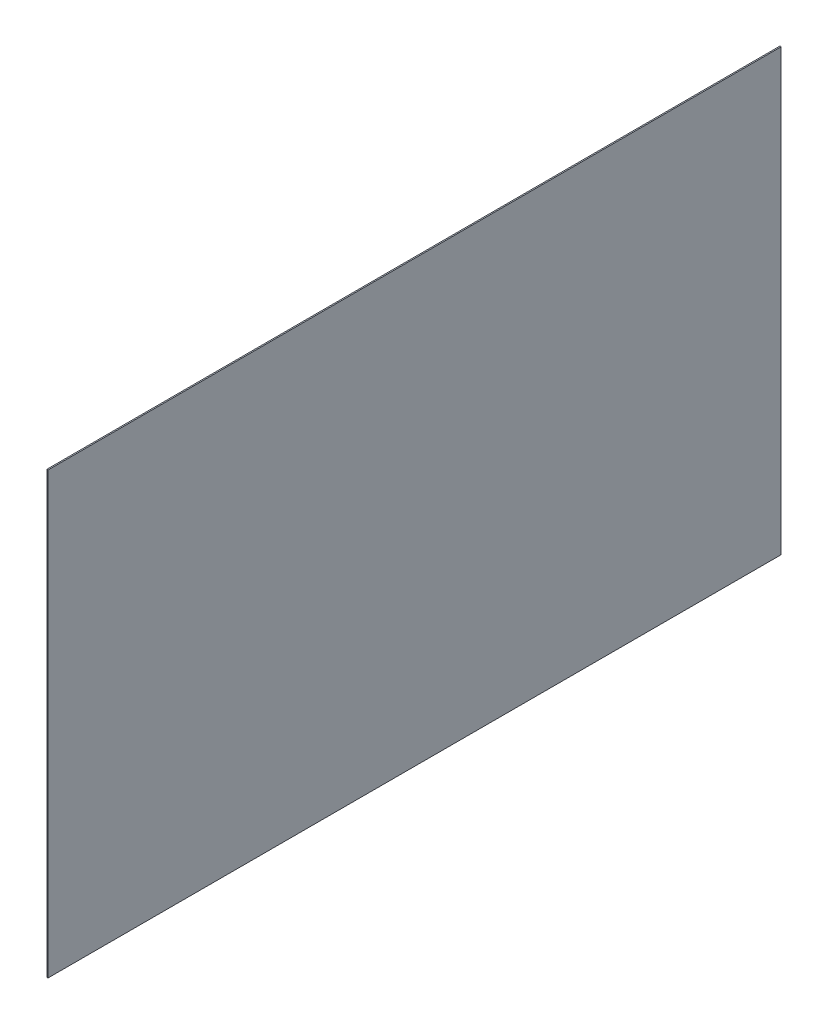
ISO-10303-21;
HEADER;
FILE_DESCRIPTION(('STEP AP214'),'2;1');
FILE_NAME('part.step','',(''),(''),'','','');
FILE_SCHEMA(('AUTOMOTIVE_DESIGN { 1 0 10303 214 1 1 1 1 }'));
ENDSEC;
DATA;
#1=APPLICATION_CONTEXT('core data for automotive mechanical design processes');
#2=APPLICATION_PROTOCOL_DEFINITION('international standard','automotive_design',2000,#1);
#3=PRODUCT_CONTEXT('',#1,'mechanical');
#4=PRODUCT('Part','Part','',(#3));
#5=PRODUCT_RELATED_PRODUCT_CATEGORY('part','',(#4));
#6=PRODUCT_DEFINITION_FORMATION('','',#4);
#7=PRODUCT_DEFINITION_CONTEXT('part definition',#1,'design');
#8=PRODUCT_DEFINITION('design','',#6,#7);
#9=PRODUCT_DEFINITION_SHAPE('','',#8);
#10=(LENGTH_UNIT() NAMED_UNIT(*) SI_UNIT(.MILLI.,.METRE.));
#11=(NAMED_UNIT(*) PLANE_ANGLE_UNIT() SI_UNIT($,.RADIAN.));
#12=(NAMED_UNIT(*) SI_UNIT($,.STERADIAN.) SOLID_ANGLE_UNIT());
#13=UNCERTAINTY_MEASURE_WITH_UNIT(LENGTH_MEASURE(1.E-05),#10,'distance_accuracy_value','');
#14=(GEOMETRIC_REPRESENTATION_CONTEXT(3) GLOBAL_UNCERTAINTY_ASSIGNED_CONTEXT((#13)) GLOBAL_UNIT_ASSIGNED_CONTEXT((#10,
#11,#12)) REPRESENTATION_CONTEXT('',''));
#15=CARTESIAN_POINT('',(0.,0.,0.));
#16=DIRECTION('',(0.,0.,1.));
#17=DIRECTION('',(1.,0.,0.));
#18=AXIS2_PLACEMENT_3D('',#15,#16,#17);
#19=CARTESIAN_POINT('',(2.54,-457.2,-762.));
#20=DIRECTION('',(0.,0.,1.));
#21=DIRECTION('',(1.,0.,0.));
#22=AXIS2_PLACEMENT_3D('',#19,#20,#21);
#23=PLANE('',#22);
#24=DIRECTION('',(0.,1.,0.));
#25=VECTOR('',#24,1.);
#26=CARTESIAN_POINT('',(0.,-457.2,-762.));
#27=LINE('',#26,#25);
#28=CARTESIAN_POINT('',(0.,-457.2,-762.));
#29=VERTEX_POINT('',#28);
#30=CARTESIAN_POINT('',(0.,457.2,-762.));
#31=VERTEX_POINT('',#30);
#32=EDGE_CURVE('E98',#29,#31,#27,.T.);
#33=ORIENTED_EDGE('',*,*,#32,.T.);
#34=DIRECTION('',(-1.,0.,0.));
#35=VECTOR('',#34,1.);
#36=CARTESIAN_POINT('',(2.54,457.2,-762.));
#37=LINE('',#36,#35);
#38=CARTESIAN_POINT('',(2.54,457.2,-762.));
#39=VERTEX_POINT('',#38);
#40=EDGE_CURVE('E11',#39,#31,#37,.T.);
#41=ORIENTED_EDGE('',*,*,#40,.F.);
#42=DIRECTION('',(0.,1.,0.));
#43=VECTOR('',#42,1.);
#44=CARTESIAN_POINT('',(2.54,-457.2,-762.));
#45=LINE('',#44,#43);
#46=CARTESIAN_POINT('',(2.54,-457.2,-762.));
#47=VERTEX_POINT('',#46);
#48=EDGE_CURVE('E86',#47,#39,#45,.T.);
#49=ORIENTED_EDGE('',*,*,#48,.F.);
#50=DIRECTION('',(-1.,0.,0.));
#51=VECTOR('',#50,1.);
#52=CARTESIAN_POINT('',(2.54,-457.2,-762.));
#53=LINE('',#52,#51);
#54=EDGE_CURVE('E94',#47,#29,#53,.T.);
#55=ORIENTED_EDGE('',*,*,#54,.T.);
#56=EDGE_LOOP('',(#33,#41,#49,#55));
#57=FACE_BOUND('',#56,.T.);
#58=ADVANCED_FACE('F35',(#57),#23,.F.);
#59=CARTESIAN_POINT('',(2.54,457.2,762.));
#60=DIRECTION('',(0.,-1.,0.));
#61=DIRECTION('',(0.,0.,-1.));
#62=AXIS2_PLACEMENT_3D('',#59,#60,#61);
#63=PLANE('',#62);
#64=DIRECTION('',(0.,0.,1.));
#65=VECTOR('',#64,1.);
#66=CARTESIAN_POINT('',(0.,457.2,762.));
#67=LINE('',#66,#65);
#68=CARTESIAN_POINT('',(0.,457.2,762.));
#69=VERTEX_POINT('',#68);
#70=EDGE_CURVE('E90',#31,#69,#67,.T.);
#71=ORIENTED_EDGE('',*,*,#70,.T.);
#72=DIRECTION('',(-1.,0.,0.));
#73=VECTOR('',#72,1.);
#74=CARTESIAN_POINT('',(2.54,457.2,762.));
#75=LINE('',#74,#73);
#76=CARTESIAN_POINT('',(2.54,457.2,762.));
#77=VERTEX_POINT('',#76);
#78=EDGE_CURVE('E43',#77,#69,#75,.T.);
#79=ORIENTED_EDGE('',*,*,#78,.F.);
#80=DIRECTION('',(0.,0.,1.));
#81=VECTOR('',#80,1.);
#82=CARTESIAN_POINT('',(2.54,457.2,762.));
#83=LINE('',#82,#81);
#84=EDGE_CURVE('E81',#39,#77,#83,.T.);
#85=ORIENTED_EDGE('',*,*,#84,.F.);
#86=ORIENTED_EDGE('',*,*,#40,.T.);
#87=EDGE_LOOP('',(#71,#79,#85,#86));
#88=FACE_BOUND('',#87,.T.);
#89=ADVANCED_FACE('F89',(#88),#63,.F.);
#90=CARTESIAN_POINT('',(2.54,-457.2,762.));
#91=DIRECTION('',(0.,0.,-1.));
#92=DIRECTION('',(-1.,0.,0.));
#93=AXIS2_PLACEMENT_3D('',#90,#91,#92);
#94=PLANE('',#93);
#95=DIRECTION('',(0.,-1.,0.));
#96=VECTOR('',#95,1.);
#97=CARTESIAN_POINT('',(0.,-457.2,762.));
#98=LINE('',#97,#96);
#99=CARTESIAN_POINT('',(0.,-457.2,762.));
#100=VERTEX_POINT('',#99);
#101=EDGE_CURVE('E68',#69,#100,#98,.T.);
#102=ORIENTED_EDGE('',*,*,#101,.T.);
#103=DIRECTION('',(-1.,0.,0.));
#104=VECTOR('',#103,1.);
#105=CARTESIAN_POINT('',(2.54,-457.2,762.));
#106=LINE('',#105,#104);
#107=CARTESIAN_POINT('',(2.54,-457.2,762.));
#108=VERTEX_POINT('',#107);
#109=EDGE_CURVE('E91',#108,#100,#106,.T.);
#110=ORIENTED_EDGE('',*,*,#109,.F.);
#111=DIRECTION('',(0.,-1.,0.));
#112=VECTOR('',#111,1.);
#113=CARTESIAN_POINT('',(2.54,-457.2,762.));
#114=LINE('',#113,#112);
#115=EDGE_CURVE('E84',#77,#108,#114,.T.);
#116=ORIENTED_EDGE('',*,*,#115,.F.);
#117=ORIENTED_EDGE('',*,*,#78,.T.);
#118=EDGE_LOOP('',(#102,#110,#116,#117));
#119=FACE_BOUND('',#118,.T.);
#120=ADVANCED_FACE('F92',(#119),#94,.F.);
#121=CARTESIAN_POINT('',(2.54,-457.2,762.));
#122=DIRECTION('',(0.,1.,0.));
#123=DIRECTION('',(0.,0.,1.));
#124=AXIS2_PLACEMENT_3D('',#121,#122,#123);
#125=PLANE('',#124);
#126=DIRECTION('',(0.,0.,-1.));
#127=VECTOR('',#126,1.);
#128=CARTESIAN_POINT('',(0.,-457.2,762.));
#129=LINE('',#128,#127);
#130=EDGE_CURVE('E74',#100,#29,#129,.T.);
#131=ORIENTED_EDGE('',*,*,#130,.T.);
#132=ORIENTED_EDGE('',*,*,#54,.F.);
#133=DIRECTION('',(0.,0.,-1.));
#134=VECTOR('',#133,1.);
#135=CARTESIAN_POINT('',(2.54,-457.2,762.));
#136=LINE('',#135,#134);
#137=EDGE_CURVE('E51',#108,#47,#136,.T.);
#138=ORIENTED_EDGE('',*,*,#137,.F.);
#139=ORIENTED_EDGE('',*,*,#109,.T.);
#140=EDGE_LOOP('',(#131,#132,#138,#139));
#141=FACE_BOUND('',#140,.T.);
#142=ADVANCED_FACE('F105',(#141),#125,.F.);
#143=CARTESIAN_POINT('',(2.54,0.,0.));
#144=DIRECTION('',(-1.,0.,0.));
#145=DIRECTION('',(0.,0.,1.));
#146=AXIS2_PLACEMENT_3D('',#143,#144,#145);
#147=PLANE('',#146);
#148=ORIENTED_EDGE('',*,*,#48,.T.);
#149=ORIENTED_EDGE('',*,*,#84,.T.);
#150=ORIENTED_EDGE('',*,*,#115,.T.);
#151=ORIENTED_EDGE('',*,*,#137,.T.);
#152=EDGE_LOOP('',(#148,#149,#150,#151));
#153=FACE_BOUND('',#152,.T.);
#154=ADVANCED_FACE('F82',(#153),#147,.F.);
#155=CARTESIAN_POINT('',(0.,0.,0.));
#156=DIRECTION('',(-1.,0.,0.));
#157=DIRECTION('',(0.,0.,1.));
#158=AXIS2_PLACEMENT_3D('',#155,#156,#157);
#159=PLANE('',#158);
#160=ORIENTED_EDGE('',*,*,#32,.F.);
#161=ORIENTED_EDGE('',*,*,#130,.F.);
#162=ORIENTED_EDGE('',*,*,#101,.F.);
#163=ORIENTED_EDGE('',*,*,#70,.F.);
#164=EDGE_LOOP('',(#160,#161,#162,#163));
#165=FACE_BOUND('',#164,.T.);
#166=ADVANCED_FACE('F108',(#165),#159,.T.);
#167=CLOSED_SHELL('',(#58,#89,#120,#142,#154,#166));
#168=MANIFOLD_SOLID_BREP('B2',#167);
#169=ADVANCED_BREP_SHAPE_REPRESENTATION('',(#18,#168),#14);
#170=SHAPE_DEFINITION_REPRESENTATION(#9,#169);
ENDSEC;
END-ISO-10303-21;
